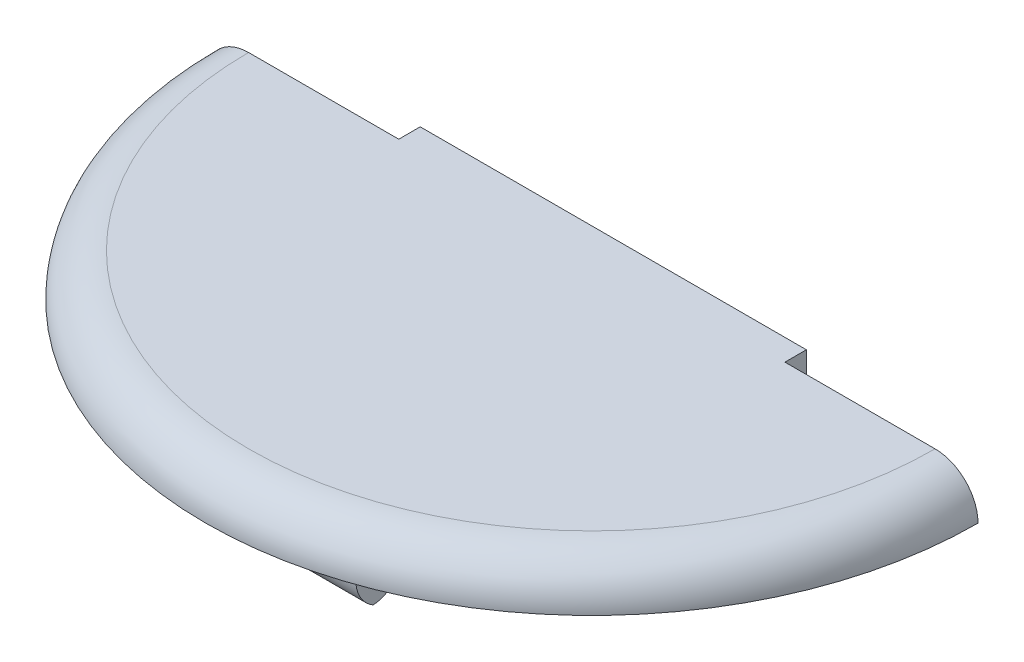
ISO-10303-21;
HEADER;
FILE_DESCRIPTION(('STEP AP214'),'2;1');
FILE_NAME('part.step','',(''),(''),'','','');
FILE_SCHEMA(('AUTOMOTIVE_DESIGN { 1 0 10303 214 1 1 1 1 }'));
ENDSEC;
DATA;
#1=APPLICATION_CONTEXT('core data for automotive mechanical design processes');
#2=APPLICATION_PROTOCOL_DEFINITION('international standard','automotive_design',2000,#1);
#3=PRODUCT_CONTEXT('',#1,'mechanical');
#4=PRODUCT('Part','Part','',(#3));
#5=PRODUCT_RELATED_PRODUCT_CATEGORY('part','',(#4));
#6=PRODUCT_DEFINITION_FORMATION('','',#4);
#7=PRODUCT_DEFINITION_CONTEXT('part definition',#1,'design');
#8=PRODUCT_DEFINITION('design','',#6,#7);
#9=PRODUCT_DEFINITION_SHAPE('','',#8);
#10=(LENGTH_UNIT() NAMED_UNIT(*) SI_UNIT(.MILLI.,.METRE.));
#11=(NAMED_UNIT(*) PLANE_ANGLE_UNIT() SI_UNIT($,.RADIAN.));
#12=(NAMED_UNIT(*) SI_UNIT($,.STERADIAN.) SOLID_ANGLE_UNIT());
#13=UNCERTAINTY_MEASURE_WITH_UNIT(LENGTH_MEASURE(1.E-05),#10,'distance_accuracy_value','');
#14=(GEOMETRIC_REPRESENTATION_CONTEXT(3) GLOBAL_UNCERTAINTY_ASSIGNED_CONTEXT((#13)) GLOBAL_UNIT_ASSIGNED_CONTEXT((#10,
#11,#12)) REPRESENTATION_CONTEXT('',''));
#15=CARTESIAN_POINT('',(0.,0.,0.));
#16=DIRECTION('',(0.,0.,1.));
#17=DIRECTION('',(1.,0.,0.));
#18=AXIS2_PLACEMENT_3D('',#15,#16,#17);
#19=CARTESIAN_POINT('',(0.,79.,0.));
#20=DIRECTION('',(0.,1.,0.));
#21=DIRECTION('',(0.,0.,1.));
#22=AXIS2_PLACEMENT_3D('',#19,#20,#21);
#23=PLANE('',#22);
#24=DIRECTION('',(0.,0.,-1.));
#25=VECTOR('',#24,1.);
#26=CARTESIAN_POINT('',(-22.5,79.,0.));
#27=LINE('',#26,#25);
#28=CARTESIAN_POINT('',(-22.5,79.,0.));
#29=VERTEX_POINT('',#28);
#30=CARTESIAN_POINT('',(-22.5,79.,-2.5));
#31=VERTEX_POINT('',#30);
#32=EDGE_CURVE('E153',#29,#31,#27,.T.);
#33=ORIENTED_EDGE('',*,*,#32,.T.);
#34=DIRECTION('',(1.,0.,0.));
#35=VECTOR('',#34,1.);
#36=CARTESIAN_POINT('',(-22.5,79.,-2.5));
#37=LINE('',#36,#35);
#38=CARTESIAN_POINT('',(22.5,79.,-2.5));
#39=VERTEX_POINT('',#38);
#40=EDGE_CURVE('E136',#31,#39,#37,.T.);
#41=ORIENTED_EDGE('',*,*,#40,.T.);
#42=DIRECTION('',(0.,0.,1.));
#43=VECTOR('',#42,1.);
#44=CARTESIAN_POINT('',(22.5,79.,0.));
#45=LINE('',#44,#43);
#46=CARTESIAN_POINT('',(22.5,79.,0.));
#47=VERTEX_POINT('',#46);
#48=EDGE_CURVE('E150',#39,#47,#45,.T.);
#49=ORIENTED_EDGE('',*,*,#48,.T.);
#50=DIRECTION('',(1.,0.,0.));
#51=VECTOR('',#50,1.);
#52=CARTESIAN_POINT('',(0.,79.,0.));
#53=LINE('',#52,#51);
#54=CARTESIAN_POINT('',(45.,79.,0.));
#55=VERTEX_POINT('',#54);
#56=EDGE_CURVE('E161',#47,#55,#53,.T.);
#57=ORIENTED_EDGE('',*,*,#56,.T.);
#58=CARTESIAN_POINT('',(0.,79.,0.));
#59=DIRECTION('',(0.,-1.,0.));
#60=DIRECTION('',(0.,0.,-1.));
#61=AXIS2_PLACEMENT_3D('',#58,#59,#60);
#62=CIRCLE('',#61,45.);
#63=CARTESIAN_POINT('',(-45.,79.,0.));
#64=VERTEX_POINT('',#63);
#65=EDGE_CURVE('E209',#55,#64,#62,.T.);
#66=ORIENTED_EDGE('',*,*,#65,.T.);
#67=DIRECTION('',(1.,0.,0.));
#68=VECTOR('',#67,1.);
#69=CARTESIAN_POINT('',(0.,79.,0.));
#70=LINE('',#69,#68);
#71=EDGE_CURVE('E170',#64,#29,#70,.T.);
#72=ORIENTED_EDGE('',*,*,#71,.T.);
#73=EDGE_LOOP('',(#33,#41,#49,#57,#66,#72));
#74=FACE_BOUND('',#73,.T.);
#75=DIRECTION('',(0.,0.,1.));
#76=VECTOR('',#75,1.);
#77=CARTESIAN_POINT('',(4.99999999999999,79.,32.5));
#78=LINE('',#77,#76);
#79=CARTESIAN_POINT('',(4.99999999999999,79.,27.5));
#80=VERTEX_POINT('',#79);
#81=CARTESIAN_POINT('',(4.99999999999999,79.,32.5));
#82=VERTEX_POINT('',#81);
#83=EDGE_CURVE('E187',#80,#82,#78,.T.);
#84=ORIENTED_EDGE('',*,*,#83,.F.);
#85=DIRECTION('',(1.,0.,0.));
#86=VECTOR('',#85,1.);
#87=CARTESIAN_POINT('',(-5.00000000000001,79.,27.5));
#88=LINE('',#87,#86);
#89=CARTESIAN_POINT('',(-5.00000000000001,79.,27.5));
#90=VERTEX_POINT('',#89);
#91=EDGE_CURVE('E198',#90,#80,#88,.T.);
#92=ORIENTED_EDGE('',*,*,#91,.F.);
#93=DIRECTION('',(0.,0.,-1.));
#94=VECTOR('',#93,1.);
#95=CARTESIAN_POINT('',(-5.00000000000001,79.,32.5));
#96=LINE('',#95,#94);
#97=CARTESIAN_POINT('',(-5.00000000000001,79.,32.5));
#98=VERTEX_POINT('',#97);
#99=EDGE_CURVE('E195',#98,#90,#96,.T.);
#100=ORIENTED_EDGE('',*,*,#99,.F.);
#101=DIRECTION('',(-1.,0.,0.));
#102=VECTOR('',#101,1.);
#103=CARTESIAN_POINT('',(-5.00000000000001,79.,32.5));
#104=LINE('',#103,#102);
#105=EDGE_CURVE('E192',#82,#98,#104,.T.);
#106=ORIENTED_EDGE('',*,*,#105,.F.);
#107=EDGE_LOOP('',(#84,#92,#100,#106));
#108=FACE_BOUND('',#107,.T.);
#109=ADVANCED_FACE('F38',(#74,#108),#23,.F.);
#110=CARTESIAN_POINT('',(40.,84.,0.));
#111=DIRECTION('',(0.,1.,0.));
#112=DIRECTION('',(0.,0.,1.));
#113=AXIS2_PLACEMENT_3D('',#110,#111,#112);
#114=PLANE('',#113);
#115=DIRECTION('',(1.,0.,0.));
#116=VECTOR('',#115,1.);
#117=CARTESIAN_POINT('',(-22.5,84.,-2.5));
#118=LINE('',#117,#116);
#119=CARTESIAN_POINT('',(-22.5,84.,-2.5));
#120=VERTEX_POINT('',#119);
#121=CARTESIAN_POINT('',(22.5,84.,-2.5));
#122=VERTEX_POINT('',#121);
#123=EDGE_CURVE('E139',#120,#122,#118,.T.);
#124=ORIENTED_EDGE('',*,*,#123,.F.);
#125=DIRECTION('',(0.,0.,-1.));
#126=VECTOR('',#125,1.);
#127=CARTESIAN_POINT('',(-22.5,84.,-7.));
#128=LINE('',#127,#126);
#129=CARTESIAN_POINT('',(-22.5,84.,0.));
#130=VERTEX_POINT('',#129);
#131=EDGE_CURVE('E163',#130,#120,#128,.T.);
#132=ORIENTED_EDGE('',*,*,#131,.F.);
#133=DIRECTION('',(1.,0.,0.));
#134=VECTOR('',#133,1.);
#135=CARTESIAN_POINT('',(-47.5,84.,0.));
#136=LINE('',#135,#134);
#137=CARTESIAN_POINT('',(-40.,84.,0.));
#138=VERTEX_POINT('',#137);
#139=EDGE_CURVE('E278',#138,#130,#136,.T.);
#140=ORIENTED_EDGE('',*,*,#139,.F.);
#141=CARTESIAN_POINT('',(0.,84.,0.));
#142=DIRECTION('',(0.,-1.,0.));
#143=DIRECTION('',(0.,0.,-1.));
#144=AXIS2_PLACEMENT_3D('',#141,#142,#143);
#145=CIRCLE('',#144,40.);
#146=CARTESIAN_POINT('',(40.,84.,0.));
#147=VERTEX_POINT('',#146);
#148=EDGE_CURVE('E210',#147,#138,#145,.T.);
#149=ORIENTED_EDGE('',*,*,#148,.F.);
#150=DIRECTION('',(1.,0.,0.));
#151=VECTOR('',#150,1.);
#152=CARTESIAN_POINT('',(47.5,84.,0.));
#153=LINE('',#152,#151);
#154=CARTESIAN_POINT('',(22.5,84.,0.));
#155=VERTEX_POINT('',#154);
#156=EDGE_CURVE('E283',#155,#147,#153,.T.);
#157=ORIENTED_EDGE('',*,*,#156,.F.);
#158=DIRECTION('',(0.,0.,1.));
#159=VECTOR('',#158,1.);
#160=CARTESIAN_POINT('',(22.5,84.,-7.));
#161=LINE('',#160,#159);
#162=EDGE_CURVE('E143',#122,#155,#161,.T.);
#163=ORIENTED_EDGE('',*,*,#162,.F.);
#164=EDGE_LOOP('',(#124,#132,#140,#149,#157,#163));
#165=FACE_BOUND('',#164,.T.);
#166=ADVANCED_FACE('F291',(#165),#114,.T.);
#167=CARTESIAN_POINT('',(0.,79.,0.));
#168=DIRECTION('',(0.,-1.,0.));
#169=DIRECTION('',(0.,0.,-1.));
#170=AXIS2_PLACEMENT_3D('',#167,#168,#169);
#171=TOROIDAL_SURFACE('',#170,40.,4.99999999999999);
#172=CARTESIAN_POINT('',(-40.,79.,0.));
#173=DIRECTION('',(0.,0.,1.));
#174=DIRECTION('',(1.,0.,0.));
#175=AXIS2_PLACEMENT_3D('',#172,#173,#174);
#176=CIRCLE('',#175,4.99999999999999);
#177=EDGE_CURVE('E213',#64,#138,#176,.F.);
#178=ORIENTED_EDGE('',*,*,#177,.F.);
#179=ORIENTED_EDGE('',*,*,#65,.F.);
#180=CARTESIAN_POINT('',(40.,79.,0.));
#181=DIRECTION('',(0.,0.,1.));
#182=DIRECTION('',(1.,0.,0.));
#183=AXIS2_PLACEMENT_3D('',#180,#181,#182);
#184=CIRCLE('',#183,4.99999999999999);
#185=EDGE_CURVE('E215',#147,#55,#184,.F.);
#186=ORIENTED_EDGE('',*,*,#185,.F.);
#187=ORIENTED_EDGE('',*,*,#148,.T.);
#188=EDGE_LOOP('',(#178,#179,#186,#187));
#189=FACE_BOUND('',#188,.T.);
#190=ADVANCED_FACE('F296',(#189),#171,.T.);
#191=CARTESIAN_POINT('',(4.99999999999999,66.,32.5));
#192=DIRECTION('',(-1.,0.,0.));
#193=DIRECTION('',(0.,0.,1.));
#194=AXIS2_PLACEMENT_3D('',#191,#192,#193);
#195=PLANE('',#194);
#196=DIRECTION('',(0.,1.,0.));
#197=VECTOR('',#196,1.);
#198=CARTESIAN_POINT('',(4.99999999999999,66.,32.5));
#199=LINE('',#198,#197);
#200=CARTESIAN_POINT('',(4.99999999999999,69.4641016151377,32.5));
#201=VERTEX_POINT('',#200);
#202=EDGE_CURVE('E207',#201,#82,#199,.T.);
#203=ORIENTED_EDGE('',*,*,#202,.F.);
#204=CARTESIAN_POINT('',(4.99999999999999,69.4641016151377,28.5));
#205=DIRECTION('',(-1.,0.,0.));
#206=DIRECTION('',(0.,0.,1.));
#207=AXIS2_PLACEMENT_3D('',#204,#205,#206);
#208=CIRCLE('',#207,4.);
#209=CARTESIAN_POINT('',(4.99999999999999,66.,30.5));
#210=VERTEX_POINT('',#209);
#211=EDGE_CURVE('E13',#201,#210,#208,.F.);
#212=ORIENTED_EDGE('',*,*,#211,.T.);
#213=CARTESIAN_POINT('',(4.99999999999999,69.,30.5));
#214=DIRECTION('',(-1.,0.,0.));
#215=DIRECTION('',(0.,0.,1.));
#216=AXIS2_PLACEMENT_3D('',#213,#214,#215);
#217=CIRCLE('',#216,3.);
#218=CARTESIAN_POINT('',(4.99999999999999,69.,27.5));
#219=VERTEX_POINT('',#218);
#220=EDGE_CURVE('E222',#210,#219,#217,.F.);
#221=ORIENTED_EDGE('',*,*,#220,.T.);
#222=DIRECTION('',(0.,1.,0.));
#223=VECTOR('',#222,1.);
#224=CARTESIAN_POINT('',(4.99999999999999,66.,27.5));
#225=LINE('',#224,#223);
#226=EDGE_CURVE('E201',#219,#80,#225,.T.);
#227=ORIENTED_EDGE('',*,*,#226,.T.);
#228=ORIENTED_EDGE('',*,*,#83,.T.);
#229=EDGE_LOOP('',(#203,#212,#221,#227,#228));
#230=FACE_BOUND('',#229,.T.);
#231=ADVANCED_FACE('F319',(#230),#195,.F.);
#232=CARTESIAN_POINT('',(-5.00000000000001,66.,32.5));
#233=DIRECTION('',(0.,0.,-1.));
#234=DIRECTION('',(-1.,0.,0.));
#235=AXIS2_PLACEMENT_3D('',#232,#233,#234);
#236=PLANE('',#235);
#237=DIRECTION('',(0.,1.,0.));
#238=VECTOR('',#237,1.);
#239=CARTESIAN_POINT('',(-5.00000000000001,66.,32.5));
#240=LINE('',#239,#238);
#241=CARTESIAN_POINT('',(-5.00000000000001,69.4641016151377,32.5));
#242=VERTEX_POINT('',#241);
#243=EDGE_CURVE('E205',#242,#98,#240,.T.);
#244=ORIENTED_EDGE('',*,*,#243,.F.);
#245=DIRECTION('',(1.,0.,0.));
#246=VECTOR('',#245,1.);
#247=CARTESIAN_POINT('',(-5.00000000000001,69.4641016151377,32.5));
#248=LINE('',#247,#246);
#249=CARTESIAN_POINT('',(-2.40372117878146,69.4641016151377,32.5));
#250=VERTEX_POINT('',#249);
#251=EDGE_CURVE('E60',#242,#250,#248,.T.);
#252=ORIENTED_EDGE('',*,*,#251,.T.);
#253=CARTESIAN_POINT('',(0.,70.8,32.5));
#254=DIRECTION('',(0.,0.,-1.));
#255=DIRECTION('',(-1.,0.,0.));
#256=AXIS2_PLACEMENT_3D('',#253,#254,#255);
#257=CIRCLE('',#256,2.75);
#258=CARTESIAN_POINT('',(2.40372117878143,69.4641016151377,32.5));
#259=VERTEX_POINT('',#258);
#260=EDGE_CURVE('E269',#250,#259,#257,.T.);
#261=ORIENTED_EDGE('',*,*,#260,.T.);
#262=DIRECTION('',(1.,0.,0.));
#263=VECTOR('',#262,1.);
#264=CARTESIAN_POINT('',(-5.00000000000001,69.4641016151377,32.5));
#265=LINE('',#264,#263);
#266=EDGE_CURVE('E54',#259,#201,#265,.T.);
#267=ORIENTED_EDGE('',*,*,#266,.T.);
#268=ORIENTED_EDGE('',*,*,#202,.T.);
#269=ORIENTED_EDGE('',*,*,#105,.T.);
#270=EDGE_LOOP('',(#244,#252,#261,#267,#268,#269));
#271=FACE_BOUND('',#270,.T.);
#272=ADVANCED_FACE('F270',(#271),#236,.F.);
#273=CARTESIAN_POINT('',(-5.00000000000001,66.,32.5));
#274=DIRECTION('',(1.,0.,0.));
#275=DIRECTION('',(0.,0.,-1.));
#276=AXIS2_PLACEMENT_3D('',#273,#274,#275);
#277=PLANE('',#276);
#278=CARTESIAN_POINT('',(-5.00000000000001,69.,30.5));
#279=DIRECTION('',(1.,0.,0.));
#280=DIRECTION('',(0.,0.,-1.));
#281=AXIS2_PLACEMENT_3D('',#278,#279,#280);
#282=CIRCLE('',#281,3.);
#283=CARTESIAN_POINT('',(-5.00000000000001,69.,27.5));
#284=VERTEX_POINT('',#283);
#285=CARTESIAN_POINT('',(-5.00000000000001,66.,30.5));
#286=VERTEX_POINT('',#285);
#287=EDGE_CURVE('E235',#284,#286,#282,.F.);
#288=ORIENTED_EDGE('',*,*,#287,.T.);
#289=CARTESIAN_POINT('',(-5.00000000000001,69.4641016151377,28.5));
#290=DIRECTION('',(1.,0.,0.));
#291=DIRECTION('',(0.,0.,-1.));
#292=AXIS2_PLACEMENT_3D('',#289,#290,#291);
#293=CIRCLE('',#292,4.);
#294=EDGE_CURVE('E253',#286,#242,#293,.F.);
#295=ORIENTED_EDGE('',*,*,#294,.T.);
#296=ORIENTED_EDGE('',*,*,#243,.T.);
#297=ORIENTED_EDGE('',*,*,#99,.T.);
#298=DIRECTION('',(0.,1.,0.));
#299=VECTOR('',#298,1.);
#300=CARTESIAN_POINT('',(-5.00000000000001,66.,27.5));
#301=LINE('',#300,#299);
#302=EDGE_CURVE('E203',#284,#90,#301,.T.);
#303=ORIENTED_EDGE('',*,*,#302,.F.);
#304=EDGE_LOOP('',(#288,#295,#296,#297,#303));
#305=FACE_BOUND('',#304,.T.);
#306=ADVANCED_FACE('F259',(#305),#277,.F.);
#307=CARTESIAN_POINT('',(-5.00000000000001,66.,27.5));
#308=DIRECTION('',(0.,0.,1.));
#309=DIRECTION('',(1.,0.,0.));
#310=AXIS2_PLACEMENT_3D('',#307,#308,#309);
#311=PLANE('',#310);
#312=ORIENTED_EDGE('',*,*,#226,.F.);
#313=DIRECTION('',(1.,0.,0.));
#314=VECTOR('',#313,1.);
#315=CARTESIAN_POINT('',(-5.00000000000001,69.,27.5));
#316=LINE('',#315,#314);
#317=CARTESIAN_POINT('',(2.07906228862917,69.,27.5));
#318=VERTEX_POINT('',#317);
#319=EDGE_CURVE('E226',#219,#318,#316,.F.);
#320=ORIENTED_EDGE('',*,*,#319,.T.);
#321=CARTESIAN_POINT('',(0.,70.8,27.5));
#322=DIRECTION('',(0.,0.,-1.));
#323=DIRECTION('',(-1.,0.,0.));
#324=AXIS2_PLACEMENT_3D('',#321,#322,#323);
#325=CIRCLE('',#324,2.75);
#326=CARTESIAN_POINT('',(-2.0790622886292,69.,27.5));
#327=VERTEX_POINT('',#326);
#328=EDGE_CURVE('E271',#327,#318,#325,.T.);
#329=ORIENTED_EDGE('',*,*,#328,.F.);
#330=DIRECTION('',(1.,0.,0.));
#331=VECTOR('',#330,1.);
#332=CARTESIAN_POINT('',(-5.00000000000001,69.,27.5));
#333=LINE('',#332,#331);
#334=EDGE_CURVE('E224',#327,#284,#333,.F.);
#335=ORIENTED_EDGE('',*,*,#334,.T.);
#336=ORIENTED_EDGE('',*,*,#302,.T.);
#337=ORIENTED_EDGE('',*,*,#91,.T.);
#338=EDGE_LOOP('',(#312,#320,#329,#335,#336,#337));
#339=FACE_BOUND('',#338,.T.);
#340=ADVANCED_FACE('F332',(#339),#311,.F.);
#341=CARTESIAN_POINT('',(47.5,77.,0.));
#342=DIRECTION('',(0.,0.,1.));
#343=DIRECTION('',(1.,0.,0.));
#344=AXIS2_PLACEMENT_3D('',#341,#342,#343);
#345=PLANE('',#344);
#346=DIRECTION('',(0.,1.,0.));
#347=VECTOR('',#346,1.);
#348=CARTESIAN_POINT('',(22.5,77.,0.));
#349=LINE('',#348,#347);
#350=EDGE_CURVE('E158',#47,#155,#349,.T.);
#351=ORIENTED_EDGE('',*,*,#350,.T.);
#352=ORIENTED_EDGE('',*,*,#156,.T.);
#353=ORIENTED_EDGE('',*,*,#185,.T.);
#354=ORIENTED_EDGE('',*,*,#56,.F.);
#355=EDGE_LOOP('',(#351,#352,#353,#354));
#356=FACE_BOUND('',#355,.T.);
#357=CARTESIAN_POINT('',(29.45,81.5,0.));
#358=DIRECTION('',(0.,0.,-1.));
#359=DIRECTION('',(-1.,0.,0.));
#360=AXIS2_PLACEMENT_3D('',#357,#358,#359);
#361=CIRCLE('',#360,1.5);
#362=CARTESIAN_POINT('',(27.95,81.5,0.));
#363=VERTEX_POINT('',#362);
#364=EDGE_CURVE('E169',#363,#363,#361,.T.);
#365=ORIENTED_EDGE('',*,*,#364,.F.);
#366=EDGE_LOOP('',(#365));
#367=FACE_BOUND('',#366,.T.);
#368=ADVANCED_FACE('F287',(#356,#367),#345,.F.);
#369=CARTESIAN_POINT('',(22.5,77.,-7.));
#370=DIRECTION('',(-1.,0.,0.));
#371=DIRECTION('',(0.,0.,1.));
#372=AXIS2_PLACEMENT_3D('',#369,#370,#371);
#373=PLANE('',#372);
#374=ORIENTED_EDGE('',*,*,#48,.F.);
#375=DIRECTION('',(0.,1.,0.));
#376=VECTOR('',#375,1.);
#377=CARTESIAN_POINT('',(22.5,79.,-2.5));
#378=LINE('',#377,#376);
#379=EDGE_CURVE('E133',#39,#122,#378,.T.);
#380=ORIENTED_EDGE('',*,*,#379,.T.);
#381=ORIENTED_EDGE('',*,*,#162,.T.);
#382=ORIENTED_EDGE('',*,*,#350,.F.);
#383=EDGE_LOOP('',(#374,#380,#381,#382));
#384=FACE_BOUND('',#383,.T.);
#385=ADVANCED_FACE('F156',(#384),#373,.F.);
#386=CARTESIAN_POINT('',(-47.5,77.,0.));
#387=DIRECTION('',(0.,0.,1.));
#388=DIRECTION('',(1.,0.,0.));
#389=AXIS2_PLACEMENT_3D('',#386,#387,#388);
#390=PLANE('',#389);
#391=ORIENTED_EDGE('',*,*,#177,.T.);
#392=ORIENTED_EDGE('',*,*,#139,.T.);
#393=DIRECTION('',(0.,1.,0.));
#394=VECTOR('',#393,1.);
#395=CARTESIAN_POINT('',(-22.5,77.,0.));
#396=LINE('',#395,#394);
#397=EDGE_CURVE('E159',#29,#130,#396,.T.);
#398=ORIENTED_EDGE('',*,*,#397,.F.);
#399=ORIENTED_EDGE('',*,*,#71,.F.);
#400=EDGE_LOOP('',(#391,#392,#398,#399));
#401=FACE_BOUND('',#400,.T.);
#402=CARTESIAN_POINT('',(-30.,81.5,0.));
#403=DIRECTION('',(0.,0.,-1.));
#404=DIRECTION('',(-1.,0.,0.));
#405=AXIS2_PLACEMENT_3D('',#402,#403,#404);
#406=CIRCLE('',#405,1.5);
#407=CARTESIAN_POINT('',(-31.5,81.5,0.));
#408=VERTEX_POINT('',#407);
#409=EDGE_CURVE('E172',#408,#408,#406,.T.);
#410=ORIENTED_EDGE('',*,*,#409,.F.);
#411=EDGE_LOOP('',(#410));
#412=FACE_BOUND('',#411,.T.);
#413=ADVANCED_FACE('F300',(#401,#412),#390,.F.);
#414=CARTESIAN_POINT('',(-22.5,77.,-7.));
#415=DIRECTION('',(1.,0.,0.));
#416=DIRECTION('',(0.,0.,-1.));
#417=AXIS2_PLACEMENT_3D('',#414,#415,#416);
#418=PLANE('',#417);
#419=ORIENTED_EDGE('',*,*,#131,.T.);
#420=DIRECTION('',(0.,1.,0.));
#421=VECTOR('',#420,1.);
#422=CARTESIAN_POINT('',(-22.5,79.,-2.5));
#423=LINE('',#422,#421);
#424=EDGE_CURVE('E144',#31,#120,#423,.T.);
#425=ORIENTED_EDGE('',*,*,#424,.F.);
#426=ORIENTED_EDGE('',*,*,#32,.F.);
#427=ORIENTED_EDGE('',*,*,#397,.T.);
#428=EDGE_LOOP('',(#419,#425,#426,#427));
#429=FACE_BOUND('',#428,.T.);
#430=ADVANCED_FACE('F303',(#429),#418,.F.);
#431=CARTESIAN_POINT('',(29.45,81.5,20.));
#432=DIRECTION('',(0.,0.,-1.));
#433=DIRECTION('',(-1.,0.,0.));
#434=AXIS2_PLACEMENT_3D('',#431,#432,#433);
#435=CYLINDRICAL_SURFACE('',#434,1.5);
#436=CARTESIAN_POINT('',(29.45,81.5,20.));
#437=DIRECTION('',(0.,0.,-1.));
#438=DIRECTION('',(-1.,0.,0.));
#439=AXIS2_PLACEMENT_3D('',#436,#437,#438);
#440=CIRCLE('',#439,1.5);
#441=CARTESIAN_POINT('',(27.95,81.5,20.));
#442=VERTEX_POINT('',#441);
#443=EDGE_CURVE('E173',#442,#442,#440,.T.);
#444=ORIENTED_EDGE('',*,*,#443,.F.);
#445=EDGE_LOOP('',(#444));
#446=FACE_BOUND('',#445,.T.);
#447=ORIENTED_EDGE('',*,*,#364,.T.);
#448=EDGE_LOOP('',(#447));
#449=FACE_BOUND('',#448,.T.);
#450=ADVANCED_FACE('F305',(#446,#449),#435,.F.);
#451=CARTESIAN_POINT('',(29.45,81.5,20.));
#452=DIRECTION('',(0.,0.,-1.));
#453=DIRECTION('',(-1.,0.,0.));
#454=AXIS2_PLACEMENT_3D('',#451,#452,#453);
#455=PLANE('',#454);
#456=ORIENTED_EDGE('',*,*,#443,.T.);
#457=EDGE_LOOP('',(#456));
#458=FACE_BOUND('',#457,.T.);
#459=ADVANCED_FACE('F310',(#458),#455,.T.);
#460=CARTESIAN_POINT('',(-30.,81.5,20.));
#461=DIRECTION('',(0.,0.,-1.));
#462=DIRECTION('',(-1.,0.,0.));
#463=AXIS2_PLACEMENT_3D('',#460,#461,#462);
#464=CYLINDRICAL_SURFACE('',#463,1.5);
#465=CARTESIAN_POINT('',(-30.,81.5,20.));
#466=DIRECTION('',(0.,0.,-1.));
#467=DIRECTION('',(-1.,0.,0.));
#468=AXIS2_PLACEMENT_3D('',#465,#466,#467);
#469=CIRCLE('',#468,1.5);
#470=CARTESIAN_POINT('',(-31.5,81.5,20.));
#471=VERTEX_POINT('',#470);
#472=EDGE_CURVE('E177',#471,#471,#469,.T.);
#473=ORIENTED_EDGE('',*,*,#472,.F.);
#474=EDGE_LOOP('',(#473));
#475=FACE_BOUND('',#474,.T.);
#476=ORIENTED_EDGE('',*,*,#409,.T.);
#477=EDGE_LOOP('',(#476));
#478=FACE_BOUND('',#477,.T.);
#479=ADVANCED_FACE('F349',(#475,#478),#464,.F.);
#480=CARTESIAN_POINT('',(-30.,81.5,20.));
#481=DIRECTION('',(0.,0.,-1.));
#482=DIRECTION('',(-1.,0.,0.));
#483=AXIS2_PLACEMENT_3D('',#480,#481,#482);
#484=PLANE('',#483);
#485=ORIENTED_EDGE('',*,*,#472,.T.);
#486=EDGE_LOOP('',(#485));
#487=FACE_BOUND('',#486,.T.);
#488=ADVANCED_FACE('F352',(#487),#484,.T.);
#489=CARTESIAN_POINT('',(-22.5,79.,-2.5));
#490=DIRECTION('',(0.,0.,1.));
#491=DIRECTION('',(1.,0.,0.));
#492=AXIS2_PLACEMENT_3D('',#489,#490,#491);
#493=PLANE('',#492);
#494=ORIENTED_EDGE('',*,*,#123,.T.);
#495=ORIENTED_EDGE('',*,*,#379,.F.);
#496=ORIENTED_EDGE('',*,*,#40,.F.);
#497=ORIENTED_EDGE('',*,*,#424,.T.);
#498=EDGE_LOOP('',(#494,#495,#496,#497));
#499=FACE_BOUND('',#498,.T.);
#500=ADVANCED_FACE('F135',(#499),#493,.F.);
#501=CARTESIAN_POINT('',(0.,70.8,32.5));
#502=DIRECTION('',(0.,0.,-1.));
#503=DIRECTION('',(-1.,0.,0.));
#504=AXIS2_PLACEMENT_3D('',#501,#502,#503);
#505=CYLINDRICAL_SURFACE('',#504,2.75);
#506=ORIENTED_EDGE('',*,*,#260,.F.);
#507=CARTESIAN_POINT('',(-2.40372117878146,69.4641016151377,32.5));
#508=CARTESIAN_POINT('',(-2.3671130284792,69.398209137616,32.5000078743555));
#509=CARTESIAN_POINT('',(-2.32778991505423,69.3338553849881,32.4983721299485));
#510=CARTESIAN_POINT('',(-2.24409636912402,69.2087182740776,32.492328081148));
#511=CARTESIAN_POINT('',(-2.19972957631147,69.1479323885316,32.4879217658196));
#512=CARTESIAN_POINT('',(-2.10642490030498,69.03051333628,32.4768672259823));
#513=CARTESIAN_POINT('',(-2.05750185132709,68.9738676955037,32.4702261048938));
#514=CARTESIAN_POINT('',(-1.95533959291393,68.8648687474732,32.4552431001918));
#515=CARTESIAN_POINT('',(-1.90209965763306,68.812516165047,32.4469009302036));
#516=CARTESIAN_POINT('',(-1.73668313813339,68.6625931626014,32.4201866692838));
#517=CARTESIAN_POINT('',(-1.61851921716736,68.5717933118049,32.4000861838755));
#518=CARTESIAN_POINT('',(-1.36910446025442,68.4104036562702,32.3596212653033));
#519=CARTESIAN_POINT('',(-1.23784195160646,68.3398320985979,32.3392566110413));
#520=CARTESIAN_POINT('',(-0.958555426572812,68.217759072708,32.3014376911243));
#521=CARTESIAN_POINT('',(-0.810028895198308,68.1673380052591,32.2841705036123));
#522=CARTESIAN_POINT('',(-0.505941674145734,68.0924165416468,32.2576715505479));
#523=CARTESIAN_POINT('',(-0.350386203648286,68.0678972321004,32.2484339227104));
#524=CARTESIAN_POINT('',(-0.0442496702940457,68.0462743358827,32.2403060544321));
#525=CARTESIAN_POINT('',(0.106234893455515,68.0479719149814,32.2409633091687));
#526=CARTESIAN_POINT('',(0.404591163576053,68.0758015795133,32.2513777039357));
#527=CARTESIAN_POINT('',(0.552462809046744,68.1019342337008,32.2611350557814));
#528=CARTESIAN_POINT('',(0.837364432845021,68.176562592806,32.287312387793));
#529=CARTESIAN_POINT('',(0.974581023309101,68.2244209499888,32.3035409798873));
#530=CARTESIAN_POINT('',(1.23948882406194,68.340909772792,32.3395495917137));
#531=CARTESIAN_POINT('',(1.36717223722684,68.4095570144553,32.3593324743943));
#532=CARTESIAN_POINT('',(1.61783318848273,68.5709380244151,32.3999495843655));
#533=CARTESIAN_POINT('',(1.74001595090648,68.6649104678546,32.4207721133605));
#534=CARTESIAN_POINT('',(1.96724334887178,68.8723036907194,32.4573716810483));
#535=CARTESIAN_POINT('',(2.0723212824674,68.9856857801804,32.4731585815633));
#536=CARTESIAN_POINT('',(2.2111906909166,69.1634658014857,32.4890870589198));
#537=CARTESIAN_POINT('',(2.25294342178272,69.2214402208739,32.493077141097));
#538=CARTESIAN_POINT('',(2.33184206248144,69.3405107231699,32.4985346667327));
#539=CARTESIAN_POINT('',(2.36899028716367,69.4016052155126,32.5000033825836));
#540=CARTESIAN_POINT('',(2.40372117878143,69.4641016151377,32.5));
#541=B_SPLINE_CURVE_WITH_KNOTS('',3,(#507,#508,#509,#510,#511,#512,#513,#514,#515,#516,#517,
#518,#519,#520,#521,#522,#523,#524,#525,#526,#527,#528,#529,#530,#531,#532,#533,#534,#535,#536,
#537,#538,#539,#540),.UNSPECIFIED.,.F.,.F.,(4,2,2,2,2,2,2,2,2,2,2,2,2,2,2,2,4),(0.,
0.226015552168922,0.451869026860382,0.677011293504959,0.902191494610035,1.35116585743356,
1.80054395508555,2.27153460903568,2.74218110884878,3.19137245084236,3.64057424853771,
4.07737391168317,4.51452700336839,4.97904222843646,5.44264207619921,5.65708433470513,
5.87141834435961),.UNSPECIFIED.);
#542=EDGE_CURVE('E47',#250,#259,#541,.T.);
#543=ORIENTED_EDGE('',*,*,#542,.T.);
#544=EDGE_LOOP('',(#506,#543));
#545=FACE_BOUND('',#544,.T.);
#546=ORIENTED_EDGE('',*,*,#328,.T.);
#547=CARTESIAN_POINT('',(2.07906228862917,69.,27.5));
#548=CARTESIAN_POINT('',(2.02915988140211,68.9423561532153,27.5000003561285));
#549=CARTESIAN_POINT('',(1.97689655847853,68.886841080234,27.5016610033238));
#550=CARTESIAN_POINT('',(1.86805993937806,68.7804360037604,27.507571477642));
#551=CARTESIAN_POINT('',(1.81148979337561,68.7295426783732,27.5118194279343));
#552=CARTESIAN_POINT('',(1.63603302486798,68.5843993578847,27.5273344647358));
#553=CARTESIAN_POINT('',(1.51121772649248,68.497476200212,27.5413780017026));
#554=CARTESIAN_POINT('',(1.24948629508389,68.3455801129558,27.5712217884898));
#555=CARTESIAN_POINT('',(1.11259149904293,68.2805694195559,27.5870189529902));
#556=CARTESIAN_POINT('',(0.829685245925261,68.1737954342198,27.6154805520698));
#557=CARTESIAN_POINT('',(0.683675715222059,68.1320272484212,27.6281456458147));
#558=CARTESIAN_POINT('',(0.383336271717144,68.0724659163264,27.6468079082809));
#559=CARTESIAN_POINT('',(0.228898526835045,68.0551672094115,27.6526671472574));
#560=CARTESIAN_POINT('',(-0.0807334476632149,68.0468288694377,27.6554455460875));
#561=CARTESIAN_POINT('',(-0.235927431335044,68.0557812027506,27.6523674410468));
#562=CARTESIAN_POINT('',(-0.534784963541218,68.0984814249976,27.6385820378744));
#563=CARTESIAN_POINT('',(-0.678643518345532,68.1310118193354,27.6282500969445));
#564=CARTESIAN_POINT('',(-0.959124202950386,68.2184913544616,27.6032266777786));
#565=CARTESIAN_POINT('',(-1.09573782504433,68.2734662206913,27.5885302022798));
#566=CARTESIAN_POINT('',(-1.36363527438541,68.4070297577991,27.5583581329861));
#567=CARTESIAN_POINT('',(-1.49449432520288,68.4864667109974,27.54287472026));
#568=CARTESIAN_POINT('',(-1.74135529418179,68.6661432810526,27.517265809746));
#569=CARTESIAN_POINT('',(-1.85739972968376,68.7663210990696,27.5071247053107));
#570=CARTESIAN_POINT('',(-1.98404849108264,68.8955693229574,27.5017498991939));
#571=CARTESIAN_POINT('',(-2.00350522526535,68.9160498241401,27.5011026716543));
#572=CARTESIAN_POINT('',(-2.04176906104037,68.9575905644061,27.5002280383166));
#573=CARTESIAN_POINT('',(-2.06057661596923,68.9786503796858,27.5000003334879));
#574=CARTESIAN_POINT('',(-2.0790622886292,69.,27.5));
#575=B_SPLINE_CURVE_WITH_KNOTS('',3,(#547,#548,#549,#550,#551,#552,#553,#554,#555,#556,#557,
#558,#559,#560,#561,#562,#563,#564,#565,#566,#567,#568,#569,#570,#571,#572,#573,#574),
.UNSPECIFIED.,.F.,.F.,(4,2,2,2,2,2,2,2,2,2,2,2,2,4),(0.,0.228535790799771,0.456905998779733,
0.912823771118286,1.36795175118551,1.8229838647766,2.28708523541927,2.75104459154928,
3.19261307296061,3.63468909932508,4.09425722230762,4.55247524376068,4.63723645946507,
4.72193723501173),.UNSPECIFIED.);
#576=EDGE_CURVE('E228',#318,#327,#575,.T.);
#577=ORIENTED_EDGE('',*,*,#576,.T.);
#578=EDGE_LOOP('',(#546,#577));
#579=FACE_BOUND('',#578,.T.);
#580=ADVANCED_FACE('F240',(#545,#579),#505,.F.);
#581=CARTESIAN_POINT('',(0.,69.,30.5));
#582=DIRECTION('',(-1.,0.,0.));
#583=DIRECTION('',(0.,0.,1.));
#584=AXIS2_PLACEMENT_3D('',#581,#582,#583);
#585=CYLINDRICAL_SURFACE('',#584,3.);
#586=ORIENTED_EDGE('',*,*,#576,.F.);
#587=ORIENTED_EDGE('',*,*,#319,.F.);
#588=ORIENTED_EDGE('',*,*,#220,.F.);
#589=DIRECTION('',(1.,0.,0.));
#590=VECTOR('',#589,1.);
#591=CARTESIAN_POINT('',(4.99999999999999,66.,30.5));
#592=LINE('',#591,#590);
#593=EDGE_CURVE('E217',#286,#210,#592,.T.);
#594=ORIENTED_EDGE('',*,*,#593,.F.);
#595=ORIENTED_EDGE('',*,*,#287,.F.);
#596=ORIENTED_EDGE('',*,*,#334,.F.);
#597=EDGE_LOOP('',(#586,#587,#588,#594,#595,#596));
#598=FACE_BOUND('',#597,.T.);
#599=ADVANCED_FACE('F237',(#598),#585,.T.);
#600=CARTESIAN_POINT('',(0.,69.4641016151377,28.5));
#601=DIRECTION('',(1.,0.,0.));
#602=DIRECTION('',(0.,0.,-1.));
#603=AXIS2_PLACEMENT_3D('',#600,#601,#602);
#604=CYLINDRICAL_SURFACE('',#603,4.);
#605=ORIENTED_EDGE('',*,*,#542,.F.);
#606=ORIENTED_EDGE('',*,*,#251,.F.);
#607=ORIENTED_EDGE('',*,*,#294,.F.);
#608=ORIENTED_EDGE('',*,*,#593,.T.);
#609=ORIENTED_EDGE('',*,*,#211,.F.);
#610=ORIENTED_EDGE('',*,*,#266,.F.);
#611=EDGE_LOOP('',(#605,#606,#607,#608,#609,#610));
#612=FACE_BOUND('',#611,.T.);
#613=ADVANCED_FACE('F40',(#612),#604,.T.);
#614=CLOSED_SHELL('',(#109,#166,#190,#231,#272,#306,#340,#368,#385,#413,#430,#450,#459,#479,
#488,#500,#580,#599,#613));
#615=CARTESIAN_POINT('',(0.,81.5,20.));
#616=DIRECTION('',(0.,0.,-1.));
#617=DIRECTION('',(-1.,0.,0.));
#618=AXIS2_PLACEMENT_3D('',#615,#616,#617);
#619=CYLINDRICAL_SURFACE('',#618,1.5);
#620=CARTESIAN_POINT('',(0.,81.5,20.));
#621=DIRECTION('',(0.,0.,-1.));
#622=DIRECTION('',(-1.,0.,0.));
#623=AXIS2_PLACEMENT_3D('',#620,#621,#622);
#624=CIRCLE('',#623,1.5);
#625=CARTESIAN_POINT('',(-1.5,81.5,20.));
#626=VERTEX_POINT('',#625);
#627=EDGE_CURVE('E184',#626,#626,#624,.T.);
#628=ORIENTED_EDGE('',*,*,#627,.F.);
#629=EDGE_LOOP('',(#628));
#630=FACE_BOUND('',#629,.T.);
#631=CARTESIAN_POINT('',(0.,81.5,0.));
#632=DIRECTION('',(0.,0.,-1.));
#633=DIRECTION('',(-1.,0.,0.));
#634=AXIS2_PLACEMENT_3D('',#631,#632,#633);
#635=CIRCLE('',#634,1.5);
#636=CARTESIAN_POINT('',(-1.5,81.5,0.));
#637=VERTEX_POINT('',#636);
#638=EDGE_CURVE('E176',#637,#637,#635,.T.);
#639=ORIENTED_EDGE('',*,*,#638,.T.);
#640=EDGE_LOOP('',(#639));
#641=FACE_BOUND('',#640,.T.);
#642=ADVANCED_FACE('F336',(#630,#641),#619,.F.);
#643=CARTESIAN_POINT('',(0.,81.5,20.));
#644=DIRECTION('',(0.,0.,-1.));
#645=DIRECTION('',(-1.,0.,0.));
#646=AXIS2_PLACEMENT_3D('',#643,#644,#645);
#647=PLANE('',#646);
#648=ORIENTED_EDGE('',*,*,#627,.T.);
#649=EDGE_LOOP('',(#648));
#650=FACE_BOUND('',#649,.T.);
#651=ADVANCED_FACE('F339',(#650),#647,.T.);
#652=CARTESIAN_POINT('',(0.,81.5,0.));
#653=DIRECTION('',(0.,0.,-1.));
#654=DIRECTION('',(-1.,0.,0.));
#655=AXIS2_PLACEMENT_3D('',#652,#653,#654);
#656=PLANE('',#655);
#657=ORIENTED_EDGE('',*,*,#638,.F.);
#658=EDGE_LOOP('',(#657));
#659=FACE_BOUND('',#658,.T.);
#660=ADVANCED_FACE('F342',(#659),#656,.F.);
#661=CLOSED_SHELL('',(#642,#651,#660));
#662=ORIENTED_CLOSED_SHELL('',*,#661,.T.);
#663=BREP_WITH_VOIDS('B2',#614,(#662));
#664=ADVANCED_BREP_SHAPE_REPRESENTATION('',(#18,#663),#14);
#665=SHAPE_DEFINITION_REPRESENTATION(#9,#664);
ENDSEC;
END-ISO-10303-21;
